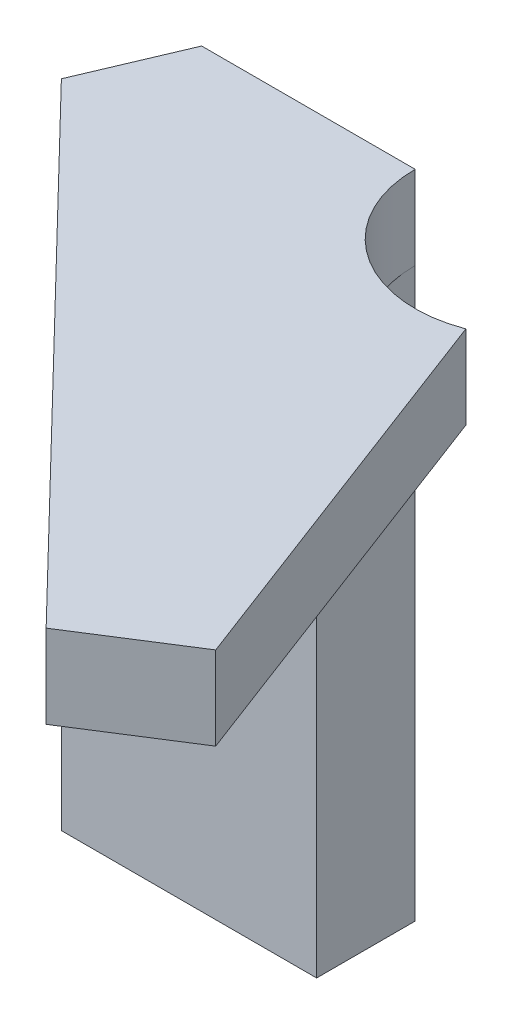
ISO-10303-21;
HEADER;
FILE_DESCRIPTION(('STEP AP214'),'2;1');
FILE_NAME('part.step','',(''),(''),'','','');
FILE_SCHEMA(('AUTOMOTIVE_DESIGN { 1 0 10303 214 1 1 1 1 }'));
ENDSEC;
DATA;
#1=APPLICATION_CONTEXT('core data for automotive mechanical design processes');
#2=APPLICATION_PROTOCOL_DEFINITION('international standard','automotive_design',2000,#1);
#3=PRODUCT_CONTEXT('',#1,'mechanical');
#4=PRODUCT('Part','Part','',(#3));
#5=PRODUCT_RELATED_PRODUCT_CATEGORY('part','',(#4));
#6=PRODUCT_DEFINITION_FORMATION('','',#4);
#7=PRODUCT_DEFINITION_CONTEXT('part definition',#1,'design');
#8=PRODUCT_DEFINITION('design','',#6,#7);
#9=PRODUCT_DEFINITION_SHAPE('','',#8);
#10=(LENGTH_UNIT() NAMED_UNIT(*) SI_UNIT(.MILLI.,.METRE.));
#11=(NAMED_UNIT(*) PLANE_ANGLE_UNIT() SI_UNIT($,.RADIAN.));
#12=(NAMED_UNIT(*) SI_UNIT($,.STERADIAN.) SOLID_ANGLE_UNIT());
#13=UNCERTAINTY_MEASURE_WITH_UNIT(LENGTH_MEASURE(1.E-05),#10,'distance_accuracy_value','');
#14=(GEOMETRIC_REPRESENTATION_CONTEXT(3) GLOBAL_UNCERTAINTY_ASSIGNED_CONTEXT((#13)) GLOBAL_UNIT_ASSIGNED_CONTEXT((#10,
#11,#12)) REPRESENTATION_CONTEXT('',''));
#15=CARTESIAN_POINT('',(0.,0.,0.));
#16=DIRECTION('',(0.,0.,1.));
#17=DIRECTION('',(1.,0.,0.));
#18=AXIS2_PLACEMENT_3D('',#15,#16,#17);
#19=CARTESIAN_POINT('',(-459.359966013958,57.1099999999993,28.9416994943124));
#20=DIRECTION('',(0.,-1.,0.));
#21=DIRECTION('',(3.01301515959196E-06,0.,-0.999999999995461));
#22=AXIS2_PLACEMENT_3D('',#19,#20,#21);
#23=PLANE('',#22);
#24=DIRECTION('',(-1.,0.,0.));
#25=VECTOR('',#24,1.);
#26=CARTESIAN_POINT('',(-510.924193780753,57.1099999999993,42.4549044435152));
#27=LINE('',#26,#25);
#28=CARTESIAN_POINT('',(-475.918740123091,57.1099999999993,42.4549044435152));
#29=VERTEX_POINT('',#28);
#30=CARTESIAN_POINT('',(-510.924193780753,57.1099999999993,42.4549044435152));
#31=VERTEX_POINT('',#30);
#32=EDGE_CURVE('E117',#29,#31,#27,.T.);
#33=ORIENTED_EDGE('',*,*,#32,.F.);
#34=DIRECTION('',(0.,0.,1.));
#35=VECTOR('',#34,1.);
#36=CARTESIAN_POINT('',(-475.918740123091,57.1099999999993,42.4549044435152));
#37=LINE('',#36,#35);
#38=CARTESIAN_POINT('',(-475.918740123091,57.1099999999993,28.9416496024986));
#39=VERTEX_POINT('',#38);
#40=EDGE_CURVE('E135',#39,#29,#37,.T.);
#41=ORIENTED_EDGE('',*,*,#40,.F.);
#42=CARTESIAN_POINT('',(-459.359966013958,57.1099999999993,28.9416994943124));
#43=DIRECTION('',(0.,-1.,0.));
#44=DIRECTION('',(1.,0.,0.));
#45=AXIS2_PLACEMENT_3D('',#42,#43,#44);
#46=CIRCLE('',#45,16.5587741092084);
#47=CARTESIAN_POINT('',(-453.485090125947,57.1099999999993,44.4232637983569));
#48=VERTEX_POINT('',#47);
#49=EDGE_CURVE('E118',#48,#39,#46,.T.);
#50=ORIENTED_EDGE('',*,*,#49,.F.);
#51=DIRECTION('',(-0.354789300783153,0.,-0.934946282975552));
#52=VECTOR('',#51,1.);
#53=CARTESIAN_POINT('',(-432.506297568139,57.1099999999993,99.7069042011047));
#54=LINE('',#53,#52);
#55=CARTESIAN_POINT('',(-432.506297568139,57.1099999999993,99.7069042011047));
#56=VERTEX_POINT('',#55);
#57=EDGE_CURVE('E67',#56,#48,#54,.T.);
#58=ORIENTED_EDGE('',*,*,#57,.F.);
#59=DIRECTION('',(0.844034911565327,0.,-0.536288232258467));
#60=VECTOR('',#59,1.);
#61=CARTESIAN_POINT('',(-446.727083924386,57.1099999999993,108.742597241542));
#62=LINE('',#61,#60);
#63=CARTESIAN_POINT('',(-446.727083924386,57.1099999999993,108.742597241542));
#64=VERTEX_POINT('',#63);
#65=EDGE_CURVE('E72',#64,#56,#62,.T.);
#66=ORIENTED_EDGE('',*,*,#65,.F.);
#67=DIRECTION('',(0.695688474208165,0.,0.718343613359175));
#68=VECTOR('',#67,1.);
#69=CARTESIAN_POINT('',(-510.924193780753,57.1099999999993,42.4549044435152));
#70=LINE('',#69,#68);
#71=EDGE_CURVE('E77',#31,#64,#70,.T.);
#72=ORIENTED_EDGE('',*,*,#71,.F.);
#73=EDGE_LOOP('',(#33,#41,#50,#58,#66,#72));
#74=FACE_BOUND('',#73,.T.);
#75=ADVANCED_FACE('F33',(#74),#23,.T.);
#76=CARTESIAN_POINT('',(-459.359966013958,68.5399999999993,28.9416994943124));
#77=DIRECTION('',(0.,1.,0.));
#78=DIRECTION('',(-1.,0.,0.));
#79=AXIS2_PLACEMENT_3D('',#76,#77,#78);
#80=PLANE('',#79);
#81=DIRECTION('',(-0.999999999995461,0.,-3.01301515943026E-06));
#82=VECTOR('',#81,1.);
#83=CARTESIAN_POINT('',(-505.199519379139,68.5399999999993,28.9415613790668));
#84=LINE('',#83,#82);
#85=CARTESIAN_POINT('',(-475.918740123091,68.5399999999993,28.9416496024986));
#86=VERTEX_POINT('',#85);
#87=CARTESIAN_POINT('',(-505.199519379139,68.5399999999993,28.9415613790668));
#88=VERTEX_POINT('',#87);
#89=EDGE_CURVE('E112',#86,#88,#84,.T.);
#90=ORIENTED_EDGE('',*,*,#89,.T.);
#91=DIRECTION('',(-0.390072871509408,0.,0.920783989278922));
#92=VECTOR('',#91,1.);
#93=CARTESIAN_POINT('',(-505.199519379139,68.5399999999993,28.9415613790668));
#94=LINE('',#93,#92);
#95=CARTESIAN_POINT('',(-510.924193780753,68.5399999999993,42.4549044435152));
#96=VERTEX_POINT('',#95);
#97=EDGE_CURVE('E110',#88,#96,#94,.T.);
#98=ORIENTED_EDGE('',*,*,#97,.T.);
#99=DIRECTION('',(0.695688474208165,0.,0.718343613359175));
#100=VECTOR('',#99,1.);
#101=CARTESIAN_POINT('',(-510.924193780753,68.5399999999993,42.4549044435152));
#102=LINE('',#101,#100);
#103=CARTESIAN_POINT('',(-446.727083924386,68.5399999999993,108.742597241542));
#104=VERTEX_POINT('',#103);
#105=EDGE_CURVE('E95',#96,#104,#102,.T.);
#106=ORIENTED_EDGE('',*,*,#105,.T.);
#107=DIRECTION('',(0.844034911565327,0.,-0.536288232258467));
#108=VECTOR('',#107,1.);
#109=CARTESIAN_POINT('',(-446.727083924386,68.5399999999993,108.742597241542));
#110=LINE('',#109,#108);
#111=CARTESIAN_POINT('',(-432.506297568139,68.5399999999993,99.7069042011047));
#112=VERTEX_POINT('',#111);
#113=EDGE_CURVE('E100',#104,#112,#110,.T.);
#114=ORIENTED_EDGE('',*,*,#113,.T.);
#115=DIRECTION('',(-0.354789300783153,0.,-0.934946282975552));
#116=VECTOR('',#115,1.);
#117=CARTESIAN_POINT('',(-432.506297568139,68.5399999999993,99.7069042011047));
#118=LINE('',#117,#116);
#119=CARTESIAN_POINT('',(-453.485090125947,68.5399999999993,44.4232637983569));
#120=VERTEX_POINT('',#119);
#121=EDGE_CURVE('E106',#112,#120,#118,.T.);
#122=ORIENTED_EDGE('',*,*,#121,.T.);
#123=CARTESIAN_POINT('',(-459.359966013958,68.5399999999993,28.9416994943124));
#124=DIRECTION('',(0.,-1.,0.));
#125=DIRECTION('',(-1.,0.,0.));
#126=AXIS2_PLACEMENT_3D('',#123,#124,#125);
#127=CIRCLE('',#126,16.5587741092084);
#128=EDGE_CURVE('E128',#120,#86,#127,.T.);
#129=ORIENTED_EDGE('',*,*,#128,.T.);
#130=EDGE_LOOP('',(#90,#98,#106,#114,#122,#129));
#131=FACE_BOUND('',#130,.T.);
#132=ADVANCED_FACE('F109',(#131),#80,.T.);
#133=CARTESIAN_POINT('',(-505.199519379139,-54.7719546269039,28.9415613790668));
#134=DIRECTION('',(-0.920783989278922,0.,-0.390072871509408));
#135=DIRECTION('',(-0.390072871509408,0.,0.920783989278922));
#136=AXIS2_PLACEMENT_3D('',#133,#134,#135);
#137=PLANE('',#136);
#138=DIRECTION('',(0.,1.,0.));
#139=VECTOR('',#138,1.);
#140=CARTESIAN_POINT('',(-505.199519379139,-54.7719546269039,28.9415613790668));
#141=LINE('',#140,#139);
#142=CARTESIAN_POINT('',(-505.199519379139,-20.7567992820007,28.9415613790668));
#143=VERTEX_POINT('',#142);
#144=EDGE_CURVE('E11',#143,#88,#141,.T.);
#145=ORIENTED_EDGE('',*,*,#144,.F.);
#146=DIRECTION('',(-0.390072871509408,0.,0.920783989278922));
#147=VECTOR('',#146,1.);
#148=CARTESIAN_POINT('',(-505.199519379139,-20.7567992820007,28.9415613790668));
#149=LINE('',#148,#147);
#150=CARTESIAN_POINT('',(-510.924193780753,-20.7567992820007,42.4549044435152));
#151=VERTEX_POINT('',#150);
#152=EDGE_CURVE('E153',#143,#151,#149,.T.);
#153=ORIENTED_EDGE('',*,*,#152,.T.);
#154=DIRECTION('',(0.,-1.,0.));
#155=VECTOR('',#154,1.);
#156=CARTESIAN_POINT('',(-510.924193780753,94.6332224969575,42.4549044435152));
#157=LINE('',#156,#155);
#158=EDGE_CURVE('E138',#31,#151,#157,.T.);
#159=ORIENTED_EDGE('',*,*,#158,.F.);
#160=DIRECTION('',(0.,1.,0.));
#161=VECTOR('',#160,1.);
#162=CARTESIAN_POINT('',(-510.924193780753,-54.7719546269039,42.4549044435152));
#163=LINE('',#162,#161);
#164=EDGE_CURVE('E125',#31,#96,#163,.T.);
#165=ORIENTED_EDGE('',*,*,#164,.T.);
#166=ORIENTED_EDGE('',*,*,#97,.F.);
#167=EDGE_LOOP('',(#145,#153,#159,#165,#166));
#168=FACE_BOUND('',#167,.T.);
#169=ADVANCED_FACE('F172',(#168),#137,.T.);
#170=CARTESIAN_POINT('',(-510.924193780753,-54.7719546269039,42.4549044435152));
#171=DIRECTION('',(-0.718343613359175,0.,0.695688474208165));
#172=DIRECTION('',(0.695688474208165,0.,0.718343613359175));
#173=AXIS2_PLACEMENT_3D('',#170,#171,#172);
#174=PLANE('',#173);
#175=ORIENTED_EDGE('',*,*,#164,.F.);
#176=ORIENTED_EDGE('',*,*,#71,.T.);
#177=DIRECTION('',(0.,1.,0.));
#178=VECTOR('',#177,1.);
#179=CARTESIAN_POINT('',(-446.727083924386,-54.7719546269039,108.742597241542));
#180=LINE('',#179,#178);
#181=EDGE_CURVE('E91',#64,#104,#180,.T.);
#182=ORIENTED_EDGE('',*,*,#181,.T.);
#183=ORIENTED_EDGE('',*,*,#105,.F.);
#184=EDGE_LOOP('',(#175,#176,#182,#183));
#185=FACE_BOUND('',#184,.T.);
#186=ADVANCED_FACE('F93',(#185),#174,.T.);
#187=CARTESIAN_POINT('',(-446.727083924386,-54.7719546269039,108.742597241542));
#188=DIRECTION('',(0.536288232258467,0.,0.844034911565327));
#189=DIRECTION('',(0.844034911565327,0.,-0.536288232258467));
#190=AXIS2_PLACEMENT_3D('',#187,#188,#189);
#191=PLANE('',#190);
#192=ORIENTED_EDGE('',*,*,#181,.F.);
#193=ORIENTED_EDGE('',*,*,#65,.T.);
#194=DIRECTION('',(0.,1.,0.));
#195=VECTOR('',#194,1.);
#196=CARTESIAN_POINT('',(-432.506297568139,-54.7719546269039,99.7069042011047));
#197=LINE('',#196,#195);
#198=EDGE_CURVE('E102',#56,#112,#197,.T.);
#199=ORIENTED_EDGE('',*,*,#198,.T.);
#200=ORIENTED_EDGE('',*,*,#113,.F.);
#201=EDGE_LOOP('',(#192,#193,#199,#200));
#202=FACE_BOUND('',#201,.T.);
#203=ADVANCED_FACE('F101',(#202),#191,.T.);
#204=CARTESIAN_POINT('',(-432.506297568139,-54.7719546269039,99.7069042011047));
#205=DIRECTION('',(0.934946282975552,0.,-0.354789300783153));
#206=DIRECTION('',(-0.354789300783153,0.,-0.934946282975552));
#207=AXIS2_PLACEMENT_3D('',#204,#205,#206);
#208=PLANE('',#207);
#209=ORIENTED_EDGE('',*,*,#198,.F.);
#210=ORIENTED_EDGE('',*,*,#57,.T.);
#211=DIRECTION('',(0.,1.,0.));
#212=VECTOR('',#211,1.);
#213=CARTESIAN_POINT('',(-453.485090125947,-54.7719546269039,44.4232637983569));
#214=LINE('',#213,#212);
#215=EDGE_CURVE('E121',#48,#120,#214,.T.);
#216=ORIENTED_EDGE('',*,*,#215,.T.);
#217=ORIENTED_EDGE('',*,*,#121,.F.);
#218=EDGE_LOOP('',(#209,#210,#216,#217));
#219=FACE_BOUND('',#218,.T.);
#220=ADVANCED_FACE('F188',(#219),#208,.T.);
#221=CARTESIAN_POINT('',(-459.359966013958,-54.7719546269039,28.9416994943124));
#222=DIRECTION('',(0.,1.,0.));
#223=DIRECTION('',(-1.,0.,0.));
#224=AXIS2_PLACEMENT_3D('',#221,#222,#223);
#225=CYLINDRICAL_SURFACE('',#224,16.5587741092084);
#226=ORIENTED_EDGE('',*,*,#215,.F.);
#227=ORIENTED_EDGE('',*,*,#49,.T.);
#228=DIRECTION('',(0.,1.,0.));
#229=VECTOR('',#228,1.);
#230=CARTESIAN_POINT('',(-475.918740123091,-54.7719546269039,28.9416496024986));
#231=LINE('',#230,#229);
#232=EDGE_CURVE('E41',#39,#86,#231,.T.);
#233=ORIENTED_EDGE('',*,*,#232,.T.);
#234=ORIENTED_EDGE('',*,*,#128,.F.);
#235=EDGE_LOOP('',(#226,#227,#233,#234));
#236=FACE_BOUND('',#235,.T.);
#237=ADVANCED_FACE('F180',(#236),#225,.F.);
#238=CARTESIAN_POINT('',(-505.199519379139,-54.7719546269039,28.9415613790668));
#239=DIRECTION('',(3.01301515943026E-06,0.,-0.999999999995461));
#240=DIRECTION('',(-0.999999999995461,0.,-3.01301515943026E-06));
#241=AXIS2_PLACEMENT_3D('',#238,#239,#240);
#242=PLANE('',#241);
#243=ORIENTED_EDGE('',*,*,#232,.F.);
#244=DIRECTION('',(0.,-1.,0.));
#245=VECTOR('',#244,1.);
#246=CARTESIAN_POINT('',(-475.918740123091,94.6332224969575,28.9416496024986));
#247=LINE('',#246,#245);
#248=CARTESIAN_POINT('',(-475.918740123091,-20.7567992820007,28.9416496024986));
#249=VERTEX_POINT('',#248);
#250=EDGE_CURVE('E144',#39,#249,#247,.T.);
#251=ORIENTED_EDGE('',*,*,#250,.T.);
#252=DIRECTION('',(-0.999999999995461,0.,-3.01301515954876E-06));
#253=VECTOR('',#252,1.);
#254=CARTESIAN_POINT('',(-475.918740123091,-20.7567992820007,28.9416496024986));
#255=LINE('',#254,#253);
#256=EDGE_CURVE('E156',#249,#143,#255,.T.);
#257=ORIENTED_EDGE('',*,*,#256,.T.);
#258=ORIENTED_EDGE('',*,*,#144,.T.);
#259=ORIENTED_EDGE('',*,*,#89,.F.);
#260=EDGE_LOOP('',(#243,#251,#257,#258,#259));
#261=FACE_BOUND('',#260,.T.);
#262=ADVANCED_FACE('F178',(#261),#242,.T.);
#263=CARTESIAN_POINT('',(0.,-20.7567992820007,0.));
#264=DIRECTION('',(0.,-1.,0.));
#265=DIRECTION('',(0.,0.,-1.));
#266=AXIS2_PLACEMENT_3D('',#263,#264,#265);
#267=PLANE('',#266);
#268=ORIENTED_EDGE('',*,*,#256,.F.);
#269=DIRECTION('',(0.,0.,-1.));
#270=VECTOR('',#269,1.);
#271=CARTESIAN_POINT('',(-475.918740123091,-20.7567992820007,42.4549044435152));
#272=LINE('',#271,#270);
#273=CARTESIAN_POINT('',(-475.918740123091,-20.7567992820007,42.4549044435152));
#274=VERTEX_POINT('',#273);
#275=EDGE_CURVE('E147',#274,#249,#272,.T.);
#276=ORIENTED_EDGE('',*,*,#275,.F.);
#277=DIRECTION('',(1.,0.,0.));
#278=VECTOR('',#277,1.);
#279=CARTESIAN_POINT('',(-510.924193780753,-20.7567992820007,42.4549044435152));
#280=LINE('',#279,#278);
#281=EDGE_CURVE('E150',#151,#274,#280,.T.);
#282=ORIENTED_EDGE('',*,*,#281,.F.);
#283=ORIENTED_EDGE('',*,*,#152,.F.);
#284=EDGE_LOOP('',(#268,#276,#282,#283));
#285=FACE_BOUND('',#284,.T.);
#286=ADVANCED_FACE('F176',(#285),#267,.T.);
#287=CARTESIAN_POINT('',(-475.918740123091,94.6332224969575,42.4549044435152));
#288=DIRECTION('',(-1.,0.,0.));
#289=DIRECTION('',(0.,0.,1.));
#290=AXIS2_PLACEMENT_3D('',#287,#288,#289);
#291=PLANE('',#290);
#292=ORIENTED_EDGE('',*,*,#250,.F.);
#293=ORIENTED_EDGE('',*,*,#40,.T.);
#294=DIRECTION('',(0.,-1.,0.));
#295=VECTOR('',#294,1.);
#296=CARTESIAN_POINT('',(-475.918740123091,94.6332224969575,42.4549044435152));
#297=LINE('',#296,#295);
#298=EDGE_CURVE('E141',#29,#274,#297,.T.);
#299=ORIENTED_EDGE('',*,*,#298,.T.);
#300=ORIENTED_EDGE('',*,*,#275,.T.);
#301=EDGE_LOOP('',(#292,#293,#299,#300));
#302=FACE_BOUND('',#301,.T.);
#303=ADVANCED_FACE('F186',(#302),#291,.F.);
#304=CARTESIAN_POINT('',(-510.924193780753,94.6332224969575,42.4549044435152));
#305=DIRECTION('',(0.,0.,-1.));
#306=DIRECTION('',(-1.,0.,0.));
#307=AXIS2_PLACEMENT_3D('',#304,#305,#306);
#308=PLANE('',#307);
#309=ORIENTED_EDGE('',*,*,#298,.F.);
#310=ORIENTED_EDGE('',*,*,#32,.T.);
#311=ORIENTED_EDGE('',*,*,#158,.T.);
#312=ORIENTED_EDGE('',*,*,#281,.T.);
#313=EDGE_LOOP('',(#309,#310,#311,#312));
#314=FACE_BOUND('',#313,.T.);
#315=ADVANCED_FACE('F161',(#314),#308,.F.);
#316=CLOSED_SHELL('',(#75,#132,#169,#186,#203,#220,#237,#262,#286,#303,#315));
#317=MANIFOLD_SOLID_BREP('B2',#316);
#318=ADVANCED_BREP_SHAPE_REPRESENTATION('',(#18,#317),#14);
#319=SHAPE_DEFINITION_REPRESENTATION(#9,#318);
ENDSEC;
END-ISO-10303-21;
